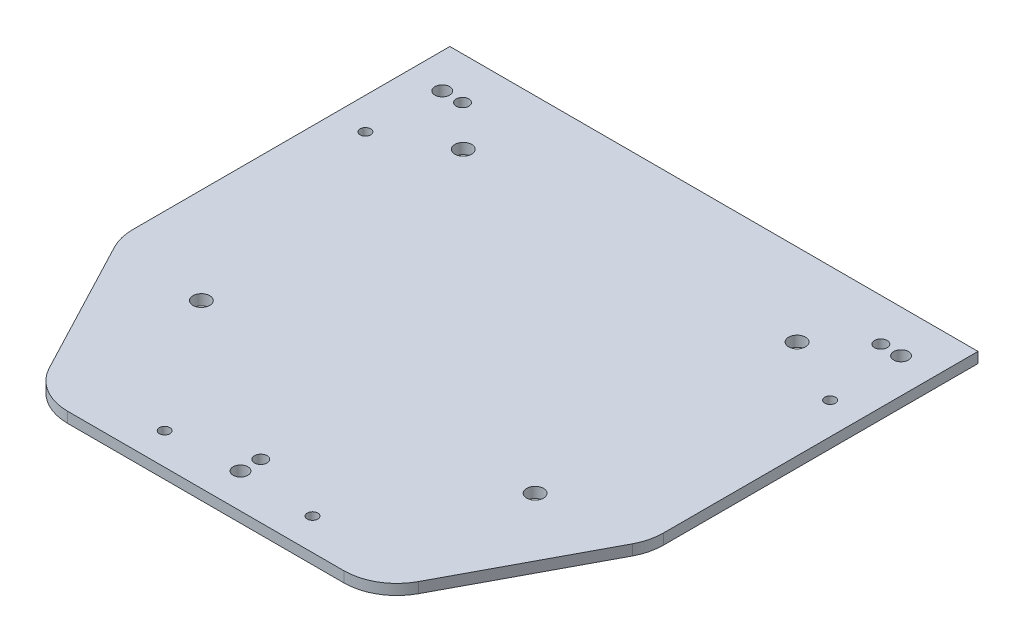
ISO-10303-21;
HEADER;
FILE_DESCRIPTION(('STEP AP214'),'2;1');
FILE_NAME('part.step','',(''),(''),'','','');
FILE_SCHEMA(('AUTOMOTIVE_DESIGN { 1 0 10303 214 1 1 1 1 }'));
ENDSEC;
DATA;
#1=APPLICATION_CONTEXT('core data for automotive mechanical design processes');
#2=APPLICATION_PROTOCOL_DEFINITION('international standard','automotive_design',2000,#1);
#3=PRODUCT_CONTEXT('',#1,'mechanical');
#4=PRODUCT('Part','Part','',(#3));
#5=PRODUCT_RELATED_PRODUCT_CATEGORY('part','',(#4));
#6=PRODUCT_DEFINITION_FORMATION('','',#4);
#7=PRODUCT_DEFINITION_CONTEXT('part definition',#1,'design');
#8=PRODUCT_DEFINITION('design','',#6,#7);
#9=PRODUCT_DEFINITION_SHAPE('','',#8);
#10=(LENGTH_UNIT() NAMED_UNIT(*) SI_UNIT(.MILLI.,.METRE.));
#11=(NAMED_UNIT(*) PLANE_ANGLE_UNIT() SI_UNIT($,.RADIAN.));
#12=(NAMED_UNIT(*) SI_UNIT($,.STERADIAN.) SOLID_ANGLE_UNIT());
#13=UNCERTAINTY_MEASURE_WITH_UNIT(LENGTH_MEASURE(1.E-05),#10,'distance_accuracy_value','');
#14=(GEOMETRIC_REPRESENTATION_CONTEXT(3) GLOBAL_UNCERTAINTY_ASSIGNED_CONTEXT((#13)) GLOBAL_UNIT_ASSIGNED_CONTEXT((#10,
#11,#12)) REPRESENTATION_CONTEXT('',''));
#15=CARTESIAN_POINT('',(0.,0.,0.));
#16=DIRECTION('',(0.,0.,1.));
#17=DIRECTION('',(1.,0.,0.));
#18=AXIS2_PLACEMENT_3D('',#15,#16,#17);
#19=CARTESIAN_POINT('',(518.913362108663,5.,276.03846469421));
#20=DIRECTION('',(0.882857773717435,0.,0.46964044905299));
#21=DIRECTION('',(0.46964044905299,0.,-0.882857773717435));
#22=AXIS2_PLACEMENT_3D('',#19,#20,#21);
#23=PLANE('',#22);
#24=DIRECTION('',(-0.46964044905299,0.,0.882857773717435));
#25=VECTOR('',#24,1.);
#26=CARTESIAN_POINT('',(518.913362108663,0.,276.03846469421));
#27=LINE('',#26,#25);
#28=CARTESIAN_POINT('',(646.338799741319,0.,36.4966228230824));
#29=VERTEX_POINT('',#28);
#30=CARTESIAN_POINT('',(611.207767027043,0.,102.538007020423));
#31=VERTEX_POINT('',#30);
#32=EDGE_CURVE('E153',#29,#31,#27,.T.);
#33=ORIENTED_EDGE('',*,*,#32,.F.);
#34=DIRECTION('',(0.,-1.,0.));
#35=VECTOR('',#34,1.);
#36=CARTESIAN_POINT('',(646.338799741319,5.,36.4966228230824));
#37=LINE('',#36,#35);
#38=CARTESIAN_POINT('',(646.338799741319,5.,36.4966228230824));
#39=VERTEX_POINT('',#38);
#40=EDGE_CURVE('E11',#39,#29,#37,.T.);
#41=ORIENTED_EDGE('',*,*,#40,.F.);
#42=DIRECTION('',(-0.46964044905299,0.,0.882857773717435));
#43=VECTOR('',#42,1.);
#44=CARTESIAN_POINT('',(518.913362108663,5.,276.03846469421));
#45=LINE('',#44,#43);
#46=CARTESIAN_POINT('',(611.207767027043,5.,102.538007020423));
#47=VERTEX_POINT('',#46);
#48=EDGE_CURVE('E187',#39,#47,#45,.T.);
#49=ORIENTED_EDGE('',*,*,#48,.T.);
#50=DIRECTION('',(0.,-1.,0.));
#51=VECTOR('',#50,1.);
#52=CARTESIAN_POINT('',(611.207767027043,5.,102.538007020423));
#53=LINE('',#52,#51);
#54=EDGE_CURVE('E99',#47,#31,#53,.T.);
#55=ORIENTED_EDGE('',*,*,#54,.T.);
#56=EDGE_LOOP('',(#33,#41,#49,#55));
#57=FACE_BOUND('',#56,.T.);
#58=ADVANCED_FACE('F40',(#57),#23,.T.);
#59=CARTESIAN_POINT('',(624.267355398383,5.,24.7556115967575));
#60=DIRECTION('',(0.,-1.,0.));
#61=DIRECTION('',(0.,0.,-1.));
#62=AXIS2_PLACEMENT_3D('',#59,#60,#61);
#63=CYLINDRICAL_SURFACE('',#62,25.);
#64=CARTESIAN_POINT('',(624.267355398383,0.,24.7556115967575));
#65=DIRECTION('',(0.,1.,0.));
#66=DIRECTION('',(0.,0.,1.));
#67=AXIS2_PLACEMENT_3D('',#64,#65,#66);
#68=CIRCLE('',#67,25.);
#69=CARTESIAN_POINT('',(649.267355398383,0.,24.7556115967574));
#70=VERTEX_POINT('',#69);
#71=EDGE_CURVE('E157',#29,#70,#68,.T.);
#72=ORIENTED_EDGE('',*,*,#71,.T.);
#73=DIRECTION('',(0.,-1.,0.));
#74=VECTOR('',#73,1.);
#75=CARTESIAN_POINT('',(649.267355398383,5.,24.7556115967574));
#76=LINE('',#75,#74);
#77=CARTESIAN_POINT('',(649.267355398383,5.,24.7556115967574));
#78=VERTEX_POINT('',#77);
#79=EDGE_CURVE('E50',#78,#70,#76,.T.);
#80=ORIENTED_EDGE('',*,*,#79,.F.);
#81=CARTESIAN_POINT('',(624.267355398383,5.,24.7556115967575));
#82=DIRECTION('',(0.,1.,0.));
#83=DIRECTION('',(0.,0.,1.));
#84=AXIS2_PLACEMENT_3D('',#81,#82,#83);
#85=CIRCLE('',#84,25.);
#86=EDGE_CURVE('E304',#39,#78,#85,.T.);
#87=ORIENTED_EDGE('',*,*,#86,.F.);
#88=ORIENTED_EDGE('',*,*,#40,.T.);
#89=EDGE_LOOP('',(#72,#80,#87,#88));
#90=FACE_BOUND('',#89,.T.);
#91=ADVANCED_FACE('F339',(#90),#63,.T.);
#92=CARTESIAN_POINT('',(649.267355398383,5.,0.));
#93=DIRECTION('',(1.,0.,0.));
#94=DIRECTION('',(0.,0.,-1.));
#95=AXIS2_PLACEMENT_3D('',#92,#93,#94);
#96=PLANE('',#95);
#97=DIRECTION('',(0.,0.,1.));
#98=VECTOR('',#97,1.);
#99=CARTESIAN_POINT('',(649.267355398383,0.,0.));
#100=LINE('',#99,#98);
#101=CARTESIAN_POINT('',(649.267355398383,0.,-124.203004205901));
#102=VERTEX_POINT('',#101);
#103=EDGE_CURVE('E162',#102,#70,#100,.T.);
#104=ORIENTED_EDGE('',*,*,#103,.F.);
#105=DIRECTION('',(0.,-1.,0.));
#106=VECTOR('',#105,1.);
#107=CARTESIAN_POINT('',(649.267355398383,5.,-124.203004205901));
#108=LINE('',#107,#106);
#109=CARTESIAN_POINT('',(649.267355398383,5.,-124.203004205901));
#110=VERTEX_POINT('',#109);
#111=EDGE_CURVE('E205',#110,#102,#108,.T.);
#112=ORIENTED_EDGE('',*,*,#111,.F.);
#113=DIRECTION('',(0.,0.,1.));
#114=VECTOR('',#113,1.);
#115=CARTESIAN_POINT('',(649.267355398383,5.,0.));
#116=LINE('',#115,#114);
#117=EDGE_CURVE('E307',#110,#78,#116,.T.);
#118=ORIENTED_EDGE('',*,*,#117,.T.);
#119=ORIENTED_EDGE('',*,*,#79,.T.);
#120=EDGE_LOOP('',(#104,#112,#118,#119));
#121=FACE_BOUND('',#120,.T.);
#122=ADVANCED_FACE('F342',(#121),#96,.T.);
#123=CARTESIAN_POINT('',(0.,5.,-124.203004205901));
#124=DIRECTION('',(0.,0.,-1.));
#125=DIRECTION('',(-1.,0.,0.));
#126=AXIS2_PLACEMENT_3D('',#123,#124,#125);
#127=PLANE('',#126);
#128=DIRECTION('',(1.,0.,0.));
#129=VECTOR('',#128,1.);
#130=CARTESIAN_POINT('',(0.,0.,-124.203004205901));
#131=LINE('',#130,#129);
#132=CARTESIAN_POINT('',(399.267355398383,0.,-124.203004205901));
#133=VERTEX_POINT('',#132);
#134=EDGE_CURVE('E166',#133,#102,#131,.T.);
#135=ORIENTED_EDGE('',*,*,#134,.F.);
#136=DIRECTION('',(0.,-1.,0.));
#137=VECTOR('',#136,1.);
#138=CARTESIAN_POINT('',(399.267355398383,5.,-124.203004205901));
#139=LINE('',#138,#137);
#140=CARTESIAN_POINT('',(399.267355398383,5.,-124.203004205901));
#141=VERTEX_POINT('',#140);
#142=EDGE_CURVE('E202',#141,#133,#139,.T.);
#143=ORIENTED_EDGE('',*,*,#142,.F.);
#144=DIRECTION('',(1.,0.,0.));
#145=VECTOR('',#144,1.);
#146=CARTESIAN_POINT('',(0.,5.,-124.203004205901));
#147=LINE('',#146,#145);
#148=EDGE_CURVE('E311',#141,#110,#147,.T.);
#149=ORIENTED_EDGE('',*,*,#148,.T.);
#150=ORIENTED_EDGE('',*,*,#111,.T.);
#151=EDGE_LOOP('',(#135,#143,#149,#150));
#152=FACE_BOUND('',#151,.T.);
#153=ADVANCED_FACE('F345',(#152),#127,.T.);
#154=CARTESIAN_POINT('',(399.267355398383,5.,0.));
#155=DIRECTION('',(1.,0.,0.));
#156=DIRECTION('',(0.,0.,-1.));
#157=AXIS2_PLACEMENT_3D('',#154,#155,#156);
#158=PLANE('',#157);
#159=DIRECTION('',(0.,0.,1.));
#160=VECTOR('',#159,1.);
#161=CARTESIAN_POINT('',(399.267355398383,0.,0.));
#162=LINE('',#161,#160);
#163=CARTESIAN_POINT('',(399.267355398383,0.,25.8238672318293));
#164=VERTEX_POINT('',#163);
#165=EDGE_CURVE('E170',#133,#164,#162,.T.);
#166=ORIENTED_EDGE('',*,*,#165,.T.);
#167=DIRECTION('',(0.,-1.,0.));
#168=VECTOR('',#167,1.);
#169=CARTESIAN_POINT('',(399.267355398383,5.,25.8238672318293));
#170=LINE('',#169,#168);
#171=CARTESIAN_POINT('',(399.267355398383,5.,25.8238672318293));
#172=VERTEX_POINT('',#171);
#173=EDGE_CURVE('E198',#172,#164,#170,.T.);
#174=ORIENTED_EDGE('',*,*,#173,.F.);
#175=DIRECTION('',(0.,0.,1.));
#176=VECTOR('',#175,1.);
#177=CARTESIAN_POINT('',(399.267355398383,5.,0.));
#178=LINE('',#177,#176);
#179=EDGE_CURVE('E315',#141,#172,#178,.T.);
#180=ORIENTED_EDGE('',*,*,#179,.F.);
#181=ORIENTED_EDGE('',*,*,#142,.T.);
#182=EDGE_LOOP('',(#166,#174,#180,#181));
#183=FACE_BOUND('',#182,.T.);
#184=ADVANCED_FACE('F348',(#183),#158,.F.);
#185=CARTESIAN_POINT('',(424.267355398383,5.,25.8238672318293));
#186=DIRECTION('',(0.,-1.,0.));
#187=DIRECTION('',(0.,0.,-1.));
#188=AXIS2_PLACEMENT_3D('',#185,#186,#187);
#189=CYLINDRICAL_SURFACE('',#188,25.);
#190=CARTESIAN_POINT('',(424.267355398383,0.,25.8238672318293));
#191=DIRECTION('',(0.,1.,0.));
#192=DIRECTION('',(0.,0.,1.));
#193=AXIS2_PLACEMENT_3D('',#190,#191,#192);
#194=CIRCLE('',#193,25.);
#195=CARTESIAN_POINT('',(402.132407827435,0.,37.4447147065775));
#196=VERTEX_POINT('',#195);
#197=EDGE_CURVE('E173',#164,#196,#194,.T.);
#198=ORIENTED_EDGE('',*,*,#197,.T.);
#199=DIRECTION('',(0.,-1.,0.));
#200=VECTOR('',#199,1.);
#201=CARTESIAN_POINT('',(402.132407827435,5.,37.4447147065775));
#202=LINE('',#201,#200);
#203=CARTESIAN_POINT('',(402.132407827435,5.,37.4447147065775));
#204=VERTEX_POINT('',#203);
#205=EDGE_CURVE('E194',#204,#196,#202,.T.);
#206=ORIENTED_EDGE('',*,*,#205,.F.);
#207=CARTESIAN_POINT('',(424.267355398383,5.,25.8238672318293));
#208=DIRECTION('',(0.,1.,0.));
#209=DIRECTION('',(0.,0.,1.));
#210=AXIS2_PLACEMENT_3D('',#207,#208,#209);
#211=CIRCLE('',#210,25.);
#212=EDGE_CURVE('E318',#172,#204,#211,.T.);
#213=ORIENTED_EDGE('',*,*,#212,.F.);
#214=ORIENTED_EDGE('',*,*,#173,.T.);
#215=EDGE_LOOP('',(#198,#206,#213,#214));
#216=FACE_BOUND('',#215,.T.);
#217=ADVANCED_FACE('F327',(#216),#189,.T.);
#218=CARTESIAN_POINT('',(299.83257823144,5.,-157.412103571507));
#219=DIRECTION('',(0.885397902837943,0.,-0.464833898989921));
#220=DIRECTION('',(-0.464833898989921,0.,-0.885397902837943));
#221=AXIS2_PLACEMENT_3D('',#218,#219,#220);
#222=PLANE('',#221);
#223=DIRECTION('',(0.464833898989921,0.,0.885397902837943));
#224=VECTOR('',#223,1.);
#225=CARTESIAN_POINT('',(299.83257823144,0.,-157.412103571507));
#226=LINE('',#225,#224);
#227=CARTESIAN_POINT('',(436.243300322626,0.,102.417843268846));
#228=VERTEX_POINT('',#227);
#229=EDGE_CURVE('E176',#196,#228,#226,.T.);
#230=ORIENTED_EDGE('',*,*,#229,.T.);
#231=DIRECTION('',(0.,-1.,0.));
#232=VECTOR('',#231,1.);
#233=CARTESIAN_POINT('',(436.243300322626,5.,102.417843268846));
#234=LINE('',#233,#232);
#235=CARTESIAN_POINT('',(436.243300322626,5.,102.417843268846));
#236=VERTEX_POINT('',#235);
#237=EDGE_CURVE('E144',#236,#228,#234,.T.);
#238=ORIENTED_EDGE('',*,*,#237,.F.);
#239=DIRECTION('',(0.464833898989921,0.,0.885397902837943));
#240=VECTOR('',#239,1.);
#241=CARTESIAN_POINT('',(299.83257823144,5.,-157.412103571507));
#242=LINE('',#241,#240);
#243=EDGE_CURVE('E129',#204,#236,#242,.T.);
#244=ORIENTED_EDGE('',*,*,#243,.F.);
#245=ORIENTED_EDGE('',*,*,#205,.T.);
#246=EDGE_LOOP('',(#230,#238,#244,#245));
#247=FACE_BOUND('',#246,.T.);
#248=ADVANCED_FACE('F331',(#247),#222,.F.);
#249=CARTESIAN_POINT('',(458.378247893574,5.,90.7969957940983));
#250=DIRECTION('',(0.,-1.,0.));
#251=DIRECTION('',(0.,0.,-1.));
#252=AXIS2_PLACEMENT_3D('',#249,#250,#251);
#253=CYLINDRICAL_SURFACE('',#252,25.);
#254=CARTESIAN_POINT('',(458.378247893574,0.,90.7969957940983));
#255=DIRECTION('',(0.,1.,0.));
#256=DIRECTION('',(0.,0.,1.));
#257=AXIS2_PLACEMENT_3D('',#254,#255,#256);
#258=CIRCLE('',#257,25.);
#259=CARTESIAN_POINT('',(458.378247893575,0.,115.796995794098));
#260=VERTEX_POINT('',#259);
#261=EDGE_CURVE('E139',#228,#260,#258,.T.);
#262=ORIENTED_EDGE('',*,*,#261,.T.);
#263=DIRECTION('',(0.,-1.,0.));
#264=VECTOR('',#263,1.);
#265=CARTESIAN_POINT('',(458.378247893575,5.,115.796995794098));
#266=LINE('',#265,#264);
#267=CARTESIAN_POINT('',(458.378247893575,5.,115.796995794098));
#268=VERTEX_POINT('',#267);
#269=EDGE_CURVE('E136',#268,#260,#266,.T.);
#270=ORIENTED_EDGE('',*,*,#269,.F.);
#271=CARTESIAN_POINT('',(458.378247893574,5.,90.7969957940983));
#272=DIRECTION('',(0.,1.,0.));
#273=DIRECTION('',(0.,0.,1.));
#274=AXIS2_PLACEMENT_3D('',#271,#272,#273);
#275=CIRCLE('',#274,25.);
#276=EDGE_CURVE('E123',#236,#268,#275,.T.);
#277=ORIENTED_EDGE('',*,*,#276,.F.);
#278=ORIENTED_EDGE('',*,*,#237,.T.);
#279=EDGE_LOOP('',(#262,#270,#277,#278));
#280=FACE_BOUND('',#279,.T.);
#281=ADVANCED_FACE('F137',(#280),#253,.T.);
#282=CARTESIAN_POINT('',(0.,5.,115.796995794098));
#283=DIRECTION('',(0.,0.,1.));
#284=DIRECTION('',(1.,0.,0.));
#285=AXIS2_PLACEMENT_3D('',#282,#283,#284);
#286=PLANE('',#285);
#287=DIRECTION('',(-1.,0.,0.));
#288=VECTOR('',#287,1.);
#289=CARTESIAN_POINT('',(0.,0.,115.796995794098));
#290=LINE('',#289,#288);
#291=CARTESIAN_POINT('',(589.136322684107,0.,115.796995794098));
#292=VERTEX_POINT('',#291);
#293=EDGE_CURVE('E181',#292,#260,#290,.T.);
#294=ORIENTED_EDGE('',*,*,#293,.F.);
#295=DIRECTION('',(0.,-1.,0.));
#296=VECTOR('',#295,1.);
#297=CARTESIAN_POINT('',(589.136322684107,5.,115.796995794098));
#298=LINE('',#297,#296);
#299=CARTESIAN_POINT('',(589.136322684107,5.,115.796995794098));
#300=VERTEX_POINT('',#299);
#301=EDGE_CURVE('E92',#300,#292,#298,.T.);
#302=ORIENTED_EDGE('',*,*,#301,.F.);
#303=DIRECTION('',(-1.,0.,0.));
#304=VECTOR('',#303,1.);
#305=CARTESIAN_POINT('',(0.,5.,115.796995794098));
#306=LINE('',#305,#304);
#307=EDGE_CURVE('E127',#300,#268,#306,.T.);
#308=ORIENTED_EDGE('',*,*,#307,.T.);
#309=ORIENTED_EDGE('',*,*,#269,.T.);
#310=EDGE_LOOP('',(#294,#302,#308,#309));
#311=FACE_BOUND('',#310,.T.);
#312=ADVANCED_FACE('F146',(#311),#286,.T.);
#313=CARTESIAN_POINT('',(589.136322684107,5.,90.7969957940983));
#314=DIRECTION('',(0.,-1.,0.));
#315=DIRECTION('',(0.,0.,-1.));
#316=AXIS2_PLACEMENT_3D('',#313,#314,#315);
#317=CYLINDRICAL_SURFACE('',#316,25.);
#318=CARTESIAN_POINT('',(589.136322684107,0.,90.7969957940983));
#319=DIRECTION('',(0.,1.,0.));
#320=DIRECTION('',(0.,0.,1.));
#321=AXIS2_PLACEMENT_3D('',#318,#319,#320);
#322=CIRCLE('',#321,25.);
#323=EDGE_CURVE('E184',#292,#31,#322,.T.);
#324=ORIENTED_EDGE('',*,*,#323,.T.);
#325=ORIENTED_EDGE('',*,*,#54,.F.);
#326=CARTESIAN_POINT('',(589.136322684107,5.,90.7969957940983));
#327=DIRECTION('',(0.,1.,0.));
#328=DIRECTION('',(0.,0.,1.));
#329=AXIS2_PLACEMENT_3D('',#326,#327,#328);
#330=CIRCLE('',#329,25.);
#331=EDGE_CURVE('E59',#300,#47,#330,.T.);
#332=ORIENTED_EDGE('',*,*,#331,.F.);
#333=ORIENTED_EDGE('',*,*,#301,.T.);
#334=EDGE_LOOP('',(#324,#325,#332,#333));
#335=FACE_BOUND('',#334,.T.);
#336=ADVANCED_FACE('F335',(#335),#317,.T.);
#337=CARTESIAN_POINT('',(0.,5.,0.));
#338=DIRECTION('',(0.,1.,0.));
#339=DIRECTION('',(0.,0.,1.));
#340=AXIS2_PLACEMENT_3D('',#337,#338,#339);
#341=PLANE('',#340);
#342=CARTESIAN_POINT('',(523.757285288841,5.,99.3969957940983));
#343=DIRECTION('',(0.,1.,0.));
#344=DIRECTION('',(0.,0.,1.));
#345=AXIS2_PLACEMENT_3D('',#342,#343,#344);
#346=CIRCLE('',#345,3.49999999999996);
#347=CARTESIAN_POINT('',(523.757285288841,5.,102.896995794098));
#348=VERTEX_POINT('',#347);
#349=EDGE_CURVE('E215',#348,#348,#346,.T.);
#350=ORIENTED_EDGE('',*,*,#349,.F.);
#351=EDGE_LOOP('',(#350));
#352=FACE_BOUND('',#351,.T.);
#353=CARTESIAN_POINT('',(425.267355398383,5.,-104.203004205901));
#354=DIRECTION('',(0.,1.,0.));
#355=DIRECTION('',(0.,0.,1.));
#356=AXIS2_PLACEMENT_3D('',#353,#354,#355);
#357=CIRCLE('',#356,2.99999999999999);
#358=CARTESIAN_POINT('',(425.267355398383,5.,-101.203004205901));
#359=VERTEX_POINT('',#358);
#360=EDGE_CURVE('E588',#359,#359,#357,.T.);
#361=ORIENTED_EDGE('',*,*,#360,.F.);
#362=EDGE_LOOP('',(#361));
#363=FACE_BOUND('',#362,.T.);
#364=CARTESIAN_POINT('',(623.267355398383,5.,-104.203004205901));
#365=DIRECTION('',(0.,1.,0.));
#366=DIRECTION('',(0.,0.,1.));
#367=AXIS2_PLACEMENT_3D('',#364,#365,#366);
#368=CIRCLE('',#367,2.99999999999994);
#369=CARTESIAN_POINT('',(623.267355398383,5.,-101.203004205901));
#370=VERTEX_POINT('',#369);
#371=EDGE_CURVE('E584',#370,#370,#368,.T.);
#372=ORIENTED_EDGE('',*,*,#371,.F.);
#373=EDGE_LOOP('',(#372));
#374=FACE_BOUND('',#373,.T.);
#375=CARTESIAN_POINT('',(415.667355398383,5.,-104.203004205901));
#376=DIRECTION('',(0.,1.,0.));
#377=DIRECTION('',(0.,0.,1.));
#378=AXIS2_PLACEMENT_3D('',#375,#376,#377);
#379=CIRCLE('',#378,3.49999999999997);
#380=CARTESIAN_POINT('',(415.667355398383,5.,-100.703004205901));
#381=VERTEX_POINT('',#380);
#382=EDGE_CURVE('E581',#381,#381,#379,.T.);
#383=ORIENTED_EDGE('',*,*,#382,.F.);
#384=EDGE_LOOP('',(#383));
#385=FACE_BOUND('',#384,.T.);
#386=CARTESIAN_POINT('',(632.867355398383,5.,-104.203004205901));
#387=DIRECTION('',(0.,1.,0.));
#388=DIRECTION('',(0.,0.,1.));
#389=AXIS2_PLACEMENT_3D('',#386,#387,#388);
#390=CIRCLE('',#389,3.49999999999996);
#391=CARTESIAN_POINT('',(632.867355398383,5.,-100.703004205901));
#392=VERTEX_POINT('',#391);
#393=EDGE_CURVE('E577',#392,#392,#390,.T.);
#394=ORIENTED_EDGE('',*,*,#393,.F.);
#395=EDGE_LOOP('',(#394));
#396=FACE_BOUND('',#395,.T.);
#397=CARTESIAN_POINT('',(523.757285288841,5.,89.7969957940983));
#398=DIRECTION('',(0.,1.,0.));
#399=DIRECTION('',(0.,0.,1.));
#400=AXIS2_PLACEMENT_3D('',#397,#398,#399);
#401=CIRCLE('',#400,3.00000000000005);
#402=CARTESIAN_POINT('',(523.757285288841,5.,92.7969957940983));
#403=VERTEX_POINT('',#402);
#404=EDGE_CURVE('E591',#403,#403,#401,.T.);
#405=ORIENTED_EDGE('',*,*,#404,.F.);
#406=EDGE_LOOP('',(#405));
#407=FACE_BOUND('',#406,.T.);
#408=CARTESIAN_POINT('',(444.595310989939,5.,38.7767001386154));
#409=DIRECTION('',(0.,1.,0.));
#410=DIRECTION('',(0.,0.,1.));
#411=AXIS2_PLACEMENT_3D('',#408,#409,#410);
#412=CIRCLE('',#411,3.99999999999999);
#413=CARTESIAN_POINT('',(444.595310989939,5.,42.7767001386154));
#414=VERTEX_POINT('',#413);
#415=EDGE_CURVE('E253',#414,#414,#412,.T.);
#416=ORIENTED_EDGE('',*,*,#415,.F.);
#417=EDGE_LOOP('',(#416));
#418=FACE_BOUND('',#417,.T.);
#419=CARTESIAN_POINT('',(602.595310989939,5.,-85.2232998613847));
#420=DIRECTION('',(0.,1.,0.));
#421=DIRECTION('',(0.,0.,1.));
#422=AXIS2_PLACEMENT_3D('',#419,#420,#421);
#423=CIRCLE('',#422,3.99999999999999);
#424=CARTESIAN_POINT('',(602.595310989939,5.,-81.2232998613847));
#425=VERTEX_POINT('',#424);
#426=EDGE_CURVE('E244',#425,#425,#423,.T.);
#427=ORIENTED_EDGE('',*,*,#426,.F.);
#428=EDGE_LOOP('',(#427));
#429=FACE_BOUND('',#428,.T.);
#430=CARTESIAN_POINT('',(444.595310989939,5.,-85.2232998613848));
#431=DIRECTION('',(0.,1.,0.));
#432=DIRECTION('',(0.,0.,1.));
#433=AXIS2_PLACEMENT_3D('',#430,#431,#432);
#434=CIRCLE('',#433,4.00000000000005);
#435=CARTESIAN_POINT('',(444.595310989939,5.,-81.2232998613847));
#436=VERTEX_POINT('',#435);
#437=EDGE_CURVE('E233',#436,#436,#434,.T.);
#438=ORIENTED_EDGE('',*,*,#437,.F.);
#439=EDGE_LOOP('',(#438));
#440=FACE_BOUND('',#439,.T.);
#441=CARTESIAN_POINT('',(602.595310989939,5.,38.7767001386155));
#442=DIRECTION('',(0.,1.,0.));
#443=DIRECTION('',(0.,0.,1.));
#444=AXIS2_PLACEMENT_3D('',#441,#442,#443);
#445=CIRCLE('',#444,3.99999999999999);
#446=CARTESIAN_POINT('',(602.595310989939,5.,42.7767001386155));
#447=VERTEX_POINT('',#446);
#448=EDGE_CURVE('E252',#447,#447,#445,.T.);
#449=ORIENTED_EDGE('',*,*,#448,.F.);
#450=EDGE_LOOP('',(#449));
#451=FACE_BOUND('',#450,.T.);
#452=CARTESIAN_POINT('',(414.267355398383,5.,-69.2030042059013));
#453=DIRECTION('',(0.,1.,0.));
#454=DIRECTION('',(0.,0.,1.));
#455=AXIS2_PLACEMENT_3D('',#452,#453,#454);
#456=CIRCLE('',#455,2.50000000000002);
#457=CARTESIAN_POINT('',(414.267355398383,5.,-66.7030042059013));
#458=VERTEX_POINT('',#457);
#459=EDGE_CURVE('E268',#458,#458,#456,.T.);
#460=ORIENTED_EDGE('',*,*,#459,.F.);
#461=EDGE_LOOP('',(#460));
#462=FACE_BOUND('',#461,.T.);
#463=CARTESIAN_POINT('',(634.267355398383,5.,-69.2030042059013));
#464=DIRECTION('',(0.,1.,0.));
#465=DIRECTION('',(0.,0.,1.));
#466=AXIS2_PLACEMENT_3D('',#463,#464,#465);
#467=CIRCLE('',#466,2.50000000000003);
#468=CARTESIAN_POINT('',(634.267355398383,5.,-66.7030042059012));
#469=VERTEX_POINT('',#468);
#470=EDGE_CURVE('E285',#469,#469,#467,.T.);
#471=ORIENTED_EDGE('',*,*,#470,.F.);
#472=EDGE_LOOP('',(#471));
#473=FACE_BOUND('',#472,.T.);
#474=CARTESIAN_POINT('',(489.267355398383,5.,100.796995794098));
#475=DIRECTION('',(0.,1.,0.));
#476=DIRECTION('',(0.,0.,1.));
#477=AXIS2_PLACEMENT_3D('',#474,#475,#476);
#478=CIRCLE('',#477,2.50000000000002);
#479=CARTESIAN_POINT('',(489.267355398383,5.,103.296995794098));
#480=VERTEX_POINT('',#479);
#481=EDGE_CURVE('E277',#480,#480,#478,.T.);
#482=ORIENTED_EDGE('',*,*,#481,.F.);
#483=EDGE_LOOP('',(#482));
#484=FACE_BOUND('',#483,.T.);
#485=CARTESIAN_POINT('',(559.267355398383,5.,100.796995794098));
#486=DIRECTION('',(0.,1.,0.));
#487=DIRECTION('',(0.,0.,1.));
#488=AXIS2_PLACEMENT_3D('',#485,#486,#487);
#489=CIRCLE('',#488,2.50000000000003);
#490=CARTESIAN_POINT('',(559.267355398383,5.,103.296995794098));
#491=VERTEX_POINT('',#490);
#492=EDGE_CURVE('E276',#491,#491,#489,.T.);
#493=ORIENTED_EDGE('',*,*,#492,.F.);
#494=EDGE_LOOP('',(#493));
#495=FACE_BOUND('',#494,.T.);
#496=ORIENTED_EDGE('',*,*,#48,.F.);
#497=ORIENTED_EDGE('',*,*,#86,.T.);
#498=ORIENTED_EDGE('',*,*,#117,.F.);
#499=ORIENTED_EDGE('',*,*,#148,.F.);
#500=ORIENTED_EDGE('',*,*,#179,.T.);
#501=ORIENTED_EDGE('',*,*,#212,.T.);
#502=ORIENTED_EDGE('',*,*,#243,.T.);
#503=ORIENTED_EDGE('',*,*,#276,.T.);
#504=ORIENTED_EDGE('',*,*,#307,.F.);
#505=ORIENTED_EDGE('',*,*,#331,.T.);
#506=EDGE_LOOP('',(#496,#497,#498,#499,#500,#501,#502,#503,#504,#505));
#507=FACE_BOUND('',#506,.T.);
#508=ADVANCED_FACE('F125',(#352,#363,#374,#385,#396,#407,#418,#429,#440,#451,#462,#473,#484,
#495,#507),#341,.T.);
#509=CARTESIAN_POINT('',(0.,0.,0.));
#510=DIRECTION('',(0.,1.,0.));
#511=DIRECTION('',(0.,0.,1.));
#512=AXIS2_PLACEMENT_3D('',#509,#510,#511);
#513=PLANE('',#512);
#514=CARTESIAN_POINT('',(523.757285288841,0.,99.3969957940983));
#515=DIRECTION('',(0.,1.,0.));
#516=DIRECTION('',(0.,0.,1.));
#517=AXIS2_PLACEMENT_3D('',#514,#515,#516);
#518=CIRCLE('',#517,3.49999999999996);
#519=CARTESIAN_POINT('',(523.757285288841,0.,102.896995794098));
#520=VERTEX_POINT('',#519);
#521=EDGE_CURVE('E43',#520,#520,#518,.T.);
#522=ORIENTED_EDGE('',*,*,#521,.T.);
#523=EDGE_LOOP('',(#522));
#524=FACE_BOUND('',#523,.T.);
#525=CARTESIAN_POINT('',(425.267355398383,0.,-104.203004205901));
#526=DIRECTION('',(0.,1.,0.));
#527=DIRECTION('',(0.,0.,1.));
#528=AXIS2_PLACEMENT_3D('',#525,#526,#527);
#529=CIRCLE('',#528,2.99999999999999);
#530=CARTESIAN_POINT('',(425.267355398383,0.,-101.203004205901));
#531=VERTEX_POINT('',#530);
#532=EDGE_CURVE('E226',#531,#531,#529,.T.);
#533=ORIENTED_EDGE('',*,*,#532,.T.);
#534=EDGE_LOOP('',(#533));
#535=FACE_BOUND('',#534,.T.);
#536=CARTESIAN_POINT('',(623.267355398383,0.,-104.203004205901));
#537=DIRECTION('',(0.,1.,0.));
#538=DIRECTION('',(0.,0.,1.));
#539=AXIS2_PLACEMENT_3D('',#536,#537,#538);
#540=CIRCLE('',#539,2.99999999999994);
#541=CARTESIAN_POINT('',(623.267355398383,0.,-101.203004205901));
#542=VERTEX_POINT('',#541);
#543=EDGE_CURVE('E223',#542,#542,#540,.T.);
#544=ORIENTED_EDGE('',*,*,#543,.T.);
#545=EDGE_LOOP('',(#544));
#546=FACE_BOUND('',#545,.T.);
#547=CARTESIAN_POINT('',(415.667355398383,0.,-104.203004205901));
#548=DIRECTION('',(0.,1.,0.));
#549=DIRECTION('',(0.,0.,1.));
#550=AXIS2_PLACEMENT_3D('',#547,#548,#549);
#551=CIRCLE('',#550,3.49999999999997);
#552=CARTESIAN_POINT('',(415.667355398383,0.,-100.703004205901));
#553=VERTEX_POINT('',#552);
#554=EDGE_CURVE('E219',#553,#553,#551,.T.);
#555=ORIENTED_EDGE('',*,*,#554,.T.);
#556=EDGE_LOOP('',(#555));
#557=FACE_BOUND('',#556,.T.);
#558=CARTESIAN_POINT('',(632.867355398383,0.,-104.203004205901));
#559=DIRECTION('',(0.,1.,0.));
#560=DIRECTION('',(0.,0.,1.));
#561=AXIS2_PLACEMENT_3D('',#558,#559,#560);
#562=CIRCLE('',#561,3.49999999999996);
#563=CARTESIAN_POINT('',(632.867355398383,0.,-100.703004205901));
#564=VERTEX_POINT('',#563);
#565=EDGE_CURVE('E214',#564,#564,#562,.T.);
#566=ORIENTED_EDGE('',*,*,#565,.T.);
#567=EDGE_LOOP('',(#566));
#568=FACE_BOUND('',#567,.T.);
#569=CARTESIAN_POINT('',(523.757285288841,0.,89.7969957940983));
#570=DIRECTION('',(0.,1.,0.));
#571=DIRECTION('',(0.,0.,1.));
#572=AXIS2_PLACEMENT_3D('',#569,#570,#571);
#573=CIRCLE('',#572,3.00000000000005);
#574=CARTESIAN_POINT('',(523.757285288841,0.,92.7969957940983));
#575=VERTEX_POINT('',#574);
#576=EDGE_CURVE('E210',#575,#575,#573,.T.);
#577=ORIENTED_EDGE('',*,*,#576,.T.);
#578=EDGE_LOOP('',(#577));
#579=FACE_BOUND('',#578,.T.);
#580=CARTESIAN_POINT('',(444.595310989939,0.,38.7767001386154));
#581=DIRECTION('',(0.,1.,0.));
#582=DIRECTION('',(0.,0.,1.));
#583=AXIS2_PLACEMENT_3D('',#580,#581,#582);
#584=CIRCLE('',#583,3.99999999999999);
#585=CARTESIAN_POINT('',(444.595310989939,0.,42.7767001386154));
#586=VERTEX_POINT('',#585);
#587=EDGE_CURVE('E248',#586,#586,#584,.T.);
#588=ORIENTED_EDGE('',*,*,#587,.T.);
#589=EDGE_LOOP('',(#588));
#590=FACE_BOUND('',#589,.T.);
#591=CARTESIAN_POINT('',(602.595310989939,0.,-85.2232998613847));
#592=DIRECTION('',(0.,1.,0.));
#593=DIRECTION('',(0.,0.,1.));
#594=AXIS2_PLACEMENT_3D('',#591,#592,#593);
#595=CIRCLE('',#594,3.99999999999999);
#596=CARTESIAN_POINT('',(602.595310989939,0.,-81.2232998613847));
#597=VERTEX_POINT('',#596);
#598=EDGE_CURVE('E257',#597,#597,#595,.T.);
#599=ORIENTED_EDGE('',*,*,#598,.T.);
#600=EDGE_LOOP('',(#599));
#601=FACE_BOUND('',#600,.T.);
#602=CARTESIAN_POINT('',(444.595310989939,0.,-85.2232998613848));
#603=DIRECTION('',(0.,1.,0.));
#604=DIRECTION('',(0.,0.,1.));
#605=AXIS2_PLACEMENT_3D('',#602,#603,#604);
#606=CIRCLE('',#605,4.00000000000005);
#607=CARTESIAN_POINT('',(444.595310989939,0.,-81.2232998613847));
#608=VERTEX_POINT('',#607);
#609=EDGE_CURVE('E238',#608,#608,#606,.T.);
#610=ORIENTED_EDGE('',*,*,#609,.T.);
#611=EDGE_LOOP('',(#610));
#612=FACE_BOUND('',#611,.T.);
#613=CARTESIAN_POINT('',(602.595310989939,0.,38.7767001386155));
#614=DIRECTION('',(0.,1.,0.));
#615=DIRECTION('',(0.,0.,1.));
#616=AXIS2_PLACEMENT_3D('',#613,#614,#615);
#617=CIRCLE('',#616,3.99999999999999);
#618=CARTESIAN_POINT('',(602.595310989939,0.,42.7767001386155));
#619=VERTEX_POINT('',#618);
#620=EDGE_CURVE('E264',#619,#619,#617,.T.);
#621=ORIENTED_EDGE('',*,*,#620,.T.);
#622=EDGE_LOOP('',(#621));
#623=FACE_BOUND('',#622,.T.);
#624=CARTESIAN_POINT('',(414.267355398383,0.,-69.2030042059013));
#625=DIRECTION('',(0.,1.,0.));
#626=DIRECTION('',(0.,0.,1.));
#627=AXIS2_PLACEMENT_3D('',#624,#625,#626);
#628=CIRCLE('',#627,2.50000000000002);
#629=CARTESIAN_POINT('',(414.267355398383,0.,-66.7030042059013));
#630=VERTEX_POINT('',#629);
#631=EDGE_CURVE('E289',#630,#630,#628,.T.);
#632=ORIENTED_EDGE('',*,*,#631,.T.);
#633=EDGE_LOOP('',(#632));
#634=FACE_BOUND('',#633,.T.);
#635=CARTESIAN_POINT('',(634.267355398383,0.,-69.2030042059013));
#636=DIRECTION('',(0.,1.,0.));
#637=DIRECTION('',(0.,0.,1.));
#638=AXIS2_PLACEMENT_3D('',#635,#636,#637);
#639=CIRCLE('',#638,2.50000000000003);
#640=CARTESIAN_POINT('',(634.267355398383,0.,-66.7030042059012));
#641=VERTEX_POINT('',#640);
#642=EDGE_CURVE('E281',#641,#641,#639,.T.);
#643=ORIENTED_EDGE('',*,*,#642,.T.);
#644=EDGE_LOOP('',(#643));
#645=FACE_BOUND('',#644,.T.);
#646=CARTESIAN_POINT('',(489.267355398383,0.,100.796995794098));
#647=DIRECTION('',(0.,1.,0.));
#648=DIRECTION('',(0.,0.,1.));
#649=AXIS2_PLACEMENT_3D('',#646,#647,#648);
#650=CIRCLE('',#649,2.50000000000002);
#651=CARTESIAN_POINT('',(489.267355398383,0.,103.296995794098));
#652=VERTEX_POINT('',#651);
#653=EDGE_CURVE('E272',#652,#652,#650,.T.);
#654=ORIENTED_EDGE('',*,*,#653,.T.);
#655=EDGE_LOOP('',(#654));
#656=FACE_BOUND('',#655,.T.);
#657=CARTESIAN_POINT('',(559.267355398383,0.,100.796995794098));
#658=DIRECTION('',(0.,1.,0.));
#659=DIRECTION('',(0.,0.,1.));
#660=AXIS2_PLACEMENT_3D('',#657,#658,#659);
#661=CIRCLE('',#660,2.50000000000003);
#662=CARTESIAN_POINT('',(559.267355398383,0.,103.296995794098));
#663=VERTEX_POINT('',#662);
#664=EDGE_CURVE('E158',#663,#663,#661,.T.);
#665=ORIENTED_EDGE('',*,*,#664,.T.);
#666=EDGE_LOOP('',(#665));
#667=FACE_BOUND('',#666,.T.);
#668=ORIENTED_EDGE('',*,*,#32,.T.);
#669=ORIENTED_EDGE('',*,*,#323,.F.);
#670=ORIENTED_EDGE('',*,*,#293,.T.);
#671=ORIENTED_EDGE('',*,*,#261,.F.);
#672=ORIENTED_EDGE('',*,*,#229,.F.);
#673=ORIENTED_EDGE('',*,*,#197,.F.);
#674=ORIENTED_EDGE('',*,*,#165,.F.);
#675=ORIENTED_EDGE('',*,*,#134,.T.);
#676=ORIENTED_EDGE('',*,*,#103,.T.);
#677=ORIENTED_EDGE('',*,*,#71,.F.);
#678=EDGE_LOOP('',(#668,#669,#670,#671,#672,#673,#674,#675,#676,#677));
#679=FACE_BOUND('',#678,.T.);
#680=ADVANCED_FACE('F333',(#524,#535,#546,#557,#568,#579,#590,#601,#612,#623,#634,#645,#656,
#667,#679),#513,.F.);
#681=CARTESIAN_POINT('',(559.267355398383,0.,100.796995794098));
#682=DIRECTION('',(0.,1.,0.));
#683=DIRECTION('',(0.,0.,1.));
#684=AXIS2_PLACEMENT_3D('',#681,#682,#683);
#685=CYLINDRICAL_SURFACE('',#684,2.50000000000003);
#686=ORIENTED_EDGE('',*,*,#664,.F.);
#687=EDGE_LOOP('',(#686));
#688=FACE_BOUND('',#687,.T.);
#689=ORIENTED_EDGE('',*,*,#492,.T.);
#690=EDGE_LOOP('',(#689));
#691=FACE_BOUND('',#690,.T.);
#692=ADVANCED_FACE('F423',(#688,#691),#685,.F.);
#693=CARTESIAN_POINT('',(489.267355398383,0.,100.796995794098));
#694=DIRECTION('',(0.,1.,0.));
#695=DIRECTION('',(0.,0.,1.));
#696=AXIS2_PLACEMENT_3D('',#693,#694,#695);
#697=CYLINDRICAL_SURFACE('',#696,2.50000000000002);
#698=ORIENTED_EDGE('',*,*,#653,.F.);
#699=EDGE_LOOP('',(#698));
#700=FACE_BOUND('',#699,.T.);
#701=ORIENTED_EDGE('',*,*,#481,.T.);
#702=EDGE_LOOP('',(#701));
#703=FACE_BOUND('',#702,.T.);
#704=ADVANCED_FACE('F428',(#700,#703),#697,.F.);
#705=CARTESIAN_POINT('',(634.267355398383,0.,-69.2030042059013));
#706=DIRECTION('',(0.,1.,0.));
#707=DIRECTION('',(0.,0.,1.));
#708=AXIS2_PLACEMENT_3D('',#705,#706,#707);
#709=CYLINDRICAL_SURFACE('',#708,2.50000000000003);
#710=ORIENTED_EDGE('',*,*,#642,.F.);
#711=EDGE_LOOP('',(#710));
#712=FACE_BOUND('',#711,.T.);
#713=ORIENTED_EDGE('',*,*,#470,.T.);
#714=EDGE_LOOP('',(#713));
#715=FACE_BOUND('',#714,.T.);
#716=ADVANCED_FACE('F440',(#712,#715),#709,.F.);
#717=CARTESIAN_POINT('',(414.267355398383,0.,-69.2030042059013));
#718=DIRECTION('',(0.,1.,0.));
#719=DIRECTION('',(0.,0.,1.));
#720=AXIS2_PLACEMENT_3D('',#717,#718,#719);
#721=CYLINDRICAL_SURFACE('',#720,2.50000000000002);
#722=ORIENTED_EDGE('',*,*,#631,.F.);
#723=EDGE_LOOP('',(#722));
#724=FACE_BOUND('',#723,.T.);
#725=ORIENTED_EDGE('',*,*,#459,.T.);
#726=EDGE_LOOP('',(#725));
#727=FACE_BOUND('',#726,.T.);
#728=ADVANCED_FACE('F450',(#724,#727),#721,.F.);
#729=CARTESIAN_POINT('',(602.595310989939,0.,38.7767001386155));
#730=DIRECTION('',(0.,1.,0.));
#731=DIRECTION('',(0.,0.,1.));
#732=AXIS2_PLACEMENT_3D('',#729,#730,#731);
#733=CYLINDRICAL_SURFACE('',#732,3.99999999999999);
#734=ORIENTED_EDGE('',*,*,#620,.F.);
#735=EDGE_LOOP('',(#734));
#736=FACE_BOUND('',#735,.T.);
#737=ORIENTED_EDGE('',*,*,#448,.T.);
#738=EDGE_LOOP('',(#737));
#739=FACE_BOUND('',#738,.T.);
#740=ADVANCED_FACE('F460',(#736,#739),#733,.F.);
#741=CARTESIAN_POINT('',(444.595310989939,0.,-85.2232998613848));
#742=DIRECTION('',(0.,1.,0.));
#743=DIRECTION('',(0.,0.,1.));
#744=AXIS2_PLACEMENT_3D('',#741,#742,#743);
#745=CYLINDRICAL_SURFACE('',#744,4.00000000000005);
#746=ORIENTED_EDGE('',*,*,#609,.F.);
#747=EDGE_LOOP('',(#746));
#748=FACE_BOUND('',#747,.T.);
#749=ORIENTED_EDGE('',*,*,#437,.T.);
#750=EDGE_LOOP('',(#749));
#751=FACE_BOUND('',#750,.T.);
#752=ADVANCED_FACE('F470',(#748,#751),#745,.F.);
#753=CARTESIAN_POINT('',(602.595310989939,0.,-85.2232998613847));
#754=DIRECTION('',(0.,1.,0.));
#755=DIRECTION('',(0.,0.,1.));
#756=AXIS2_PLACEMENT_3D('',#753,#754,#755);
#757=CYLINDRICAL_SURFACE('',#756,3.99999999999999);
#758=ORIENTED_EDGE('',*,*,#598,.F.);
#759=EDGE_LOOP('',(#758));
#760=FACE_BOUND('',#759,.T.);
#761=ORIENTED_EDGE('',*,*,#426,.T.);
#762=EDGE_LOOP('',(#761));
#763=FACE_BOUND('',#762,.T.);
#764=ADVANCED_FACE('F480',(#760,#763),#757,.F.);
#765=CARTESIAN_POINT('',(444.595310989939,0.,38.7767001386154));
#766=DIRECTION('',(0.,1.,0.));
#767=DIRECTION('',(0.,0.,1.));
#768=AXIS2_PLACEMENT_3D('',#765,#766,#767);
#769=CYLINDRICAL_SURFACE('',#768,3.99999999999999);
#770=ORIENTED_EDGE('',*,*,#587,.F.);
#771=EDGE_LOOP('',(#770));
#772=FACE_BOUND('',#771,.T.);
#773=ORIENTED_EDGE('',*,*,#415,.T.);
#774=EDGE_LOOP('',(#773));
#775=FACE_BOUND('',#774,.T.);
#776=ADVANCED_FACE('F490',(#772,#775),#769,.F.);
#777=CARTESIAN_POINT('',(523.757285288841,-5.,89.7969957940983));
#778=DIRECTION('',(0.,1.,0.));
#779=DIRECTION('',(0.,0.,1.));
#780=AXIS2_PLACEMENT_3D('',#777,#778,#779);
#781=CYLINDRICAL_SURFACE('',#780,3.00000000000005);
#782=ORIENTED_EDGE('',*,*,#404,.T.);
#783=EDGE_LOOP('',(#782));
#784=FACE_BOUND('',#783,.T.);
#785=ORIENTED_EDGE('',*,*,#576,.F.);
#786=EDGE_LOOP('',(#785));
#787=FACE_BOUND('',#786,.T.);
#788=ADVANCED_FACE('F500',(#784,#787),#781,.F.);
#789=CARTESIAN_POINT('',(632.867355398383,-5.,-104.203004205901));
#790=DIRECTION('',(0.,1.,0.));
#791=DIRECTION('',(0.,0.,1.));
#792=AXIS2_PLACEMENT_3D('',#789,#790,#791);
#793=CYLINDRICAL_SURFACE('',#792,3.49999999999996);
#794=ORIENTED_EDGE('',*,*,#393,.T.);
#795=EDGE_LOOP('',(#794));
#796=FACE_BOUND('',#795,.T.);
#797=ORIENTED_EDGE('',*,*,#565,.F.);
#798=EDGE_LOOP('',(#797));
#799=FACE_BOUND('',#798,.T.);
#800=ADVANCED_FACE('F519',(#796,#799),#793,.F.);
#801=CARTESIAN_POINT('',(415.667355398383,-5.,-104.203004205901));
#802=DIRECTION('',(0.,1.,0.));
#803=DIRECTION('',(0.,0.,1.));
#804=AXIS2_PLACEMENT_3D('',#801,#802,#803);
#805=CYLINDRICAL_SURFACE('',#804,3.49999999999997);
#806=ORIENTED_EDGE('',*,*,#382,.T.);
#807=EDGE_LOOP('',(#806));
#808=FACE_BOUND('',#807,.T.);
#809=ORIENTED_EDGE('',*,*,#554,.F.);
#810=EDGE_LOOP('',(#809));
#811=FACE_BOUND('',#810,.T.);
#812=ADVANCED_FACE('F529',(#808,#811),#805,.F.);
#813=CARTESIAN_POINT('',(623.267355398383,-5.,-104.203004205901));
#814=DIRECTION('',(0.,1.,0.));
#815=DIRECTION('',(0.,0.,1.));
#816=AXIS2_PLACEMENT_3D('',#813,#814,#815);
#817=CYLINDRICAL_SURFACE('',#816,2.99999999999994);
#818=ORIENTED_EDGE('',*,*,#371,.T.);
#819=EDGE_LOOP('',(#818));
#820=FACE_BOUND('',#819,.T.);
#821=ORIENTED_EDGE('',*,*,#543,.F.);
#822=EDGE_LOOP('',(#821));
#823=FACE_BOUND('',#822,.T.);
#824=ADVANCED_FACE('F539',(#820,#823),#817,.F.);
#825=CARTESIAN_POINT('',(425.267355398383,-5.,-104.203004205901));
#826=DIRECTION('',(0.,1.,0.));
#827=DIRECTION('',(0.,0.,1.));
#828=AXIS2_PLACEMENT_3D('',#825,#826,#827);
#829=CYLINDRICAL_SURFACE('',#828,2.99999999999999);
#830=ORIENTED_EDGE('',*,*,#360,.T.);
#831=EDGE_LOOP('',(#830));
#832=FACE_BOUND('',#831,.T.);
#833=ORIENTED_EDGE('',*,*,#532,.F.);
#834=EDGE_LOOP('',(#833));
#835=FACE_BOUND('',#834,.T.);
#836=ADVANCED_FACE('F549',(#832,#835),#829,.F.);
#837=CARTESIAN_POINT('',(523.757285288841,-5.,99.3969957940983));
#838=DIRECTION('',(0.,1.,0.));
#839=DIRECTION('',(0.,0.,1.));
#840=AXIS2_PLACEMENT_3D('',#837,#838,#839);
#841=CYLINDRICAL_SURFACE('',#840,3.49999999999996);
#842=ORIENTED_EDGE('',*,*,#349,.T.);
#843=EDGE_LOOP('',(#842));
#844=FACE_BOUND('',#843,.T.);
#845=ORIENTED_EDGE('',*,*,#521,.F.);
#846=EDGE_LOOP('',(#845));
#847=FACE_BOUND('',#846,.T.);
#848=ADVANCED_FACE('F559',(#844,#847),#841,.F.);
#849=CLOSED_SHELL('',(#58,#91,#122,#153,#184,#217,#248,#281,#312,#336,#508,#680,#692,#704,#716,
#728,#740,#752,#764,#776,#788,#800,#812,#824,#836,#848));
#850=MANIFOLD_SOLID_BREP('B2',#849);
#851=ADVANCED_BREP_SHAPE_REPRESENTATION('',(#18,#850),#14);
#852=SHAPE_DEFINITION_REPRESENTATION(#9,#851);
ENDSEC;
END-ISO-10303-21;
